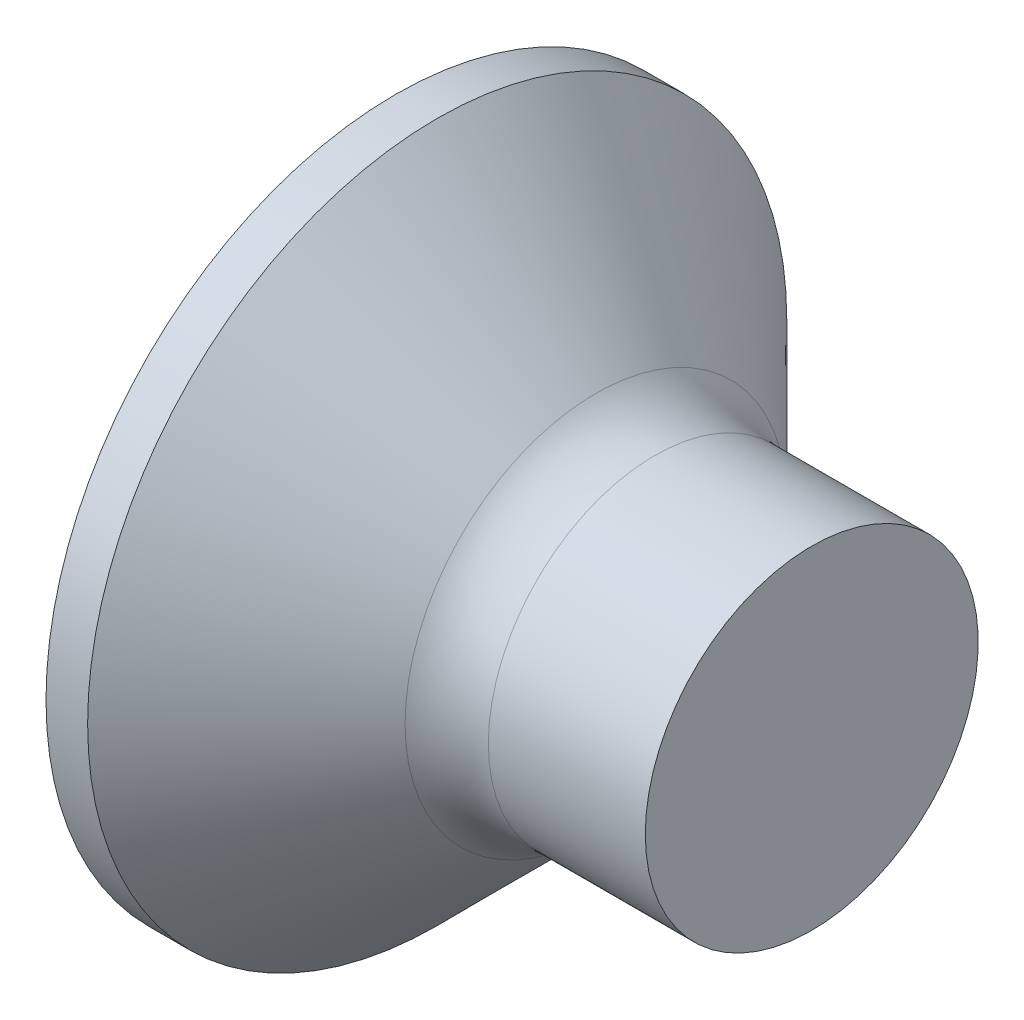
ISO-10303-21;
HEADER;
FILE_DESCRIPTION(('STEP AP214'),'2;1');
FILE_NAME('part.step','',(''),(''),'','','');
FILE_SCHEMA(('AUTOMOTIVE_DESIGN { 1 0 10303 214 1 1 1 1 }'));
ENDSEC;
DATA;
#1=APPLICATION_CONTEXT('core data for automotive mechanical design processes');
#2=APPLICATION_PROTOCOL_DEFINITION('international standard','automotive_design',2000,#1);
#3=PRODUCT_CONTEXT('',#1,'mechanical');
#4=PRODUCT('Part','Part','',(#3));
#5=PRODUCT_RELATED_PRODUCT_CATEGORY('part','',(#4));
#6=PRODUCT_DEFINITION_FORMATION('','',#4);
#7=PRODUCT_DEFINITION_CONTEXT('part definition',#1,'design');
#8=PRODUCT_DEFINITION('design','',#6,#7);
#9=PRODUCT_DEFINITION_SHAPE('','',#8);
#10=(LENGTH_UNIT() NAMED_UNIT(*) SI_UNIT(.MILLI.,.METRE.));
#11=(NAMED_UNIT(*) PLANE_ANGLE_UNIT() SI_UNIT($,.RADIAN.));
#12=(NAMED_UNIT(*) SI_UNIT($,.STERADIAN.) SOLID_ANGLE_UNIT());
#13=UNCERTAINTY_MEASURE_WITH_UNIT(LENGTH_MEASURE(1.E-05),#10,'distance_accuracy_value','');
#14=(GEOMETRIC_REPRESENTATION_CONTEXT(3) GLOBAL_UNCERTAINTY_ASSIGNED_CONTEXT((#13)) GLOBAL_UNIT_ASSIGNED_CONTEXT((#10,
#11,#12)) REPRESENTATION_CONTEXT('',''));
#15=CARTESIAN_POINT('',(0.,0.,0.));
#16=DIRECTION('',(0.,0.,1.));
#17=DIRECTION('',(1.,0.,0.));
#18=AXIS2_PLACEMENT_3D('',#15,#16,#17);
#19=CARTESIAN_POINT('',(9.32000000000025,0.,4.16333634234434E-13));
#20=DIRECTION('',(-1.00000000000003,0.,0.));
#21=DIRECTION('',(0.,-1.00000000000001,0.));
#22=AXIS2_PLACEMENT_3D('',#19,#20,#21);
#23=SPHERICAL_SURFACE('',#22,9.32000000000001);
#24=CARTESIAN_POINT('',(1.,0.,0.));
#25=DIRECTION('',(-1.00000000000003,0.,0.));
#26=DIRECTION('',(0.,0.,1.00000000000002));
#27=AXIS2_PLACEMENT_3D('',#24,#25,#26);
#28=CIRCLE('',#27,4.2);
#29=CARTESIAN_POINT('',(1.00000000000003,0.,4.20000000000008));
#30=VERTEX_POINT('',#29);
#31=EDGE_CURVE('E219',#30,#30,#28,.T.);
#32=ORIENTED_EDGE('',*,*,#31,.T.);
#33=EDGE_LOOP('',(#32));
#34=FACE_BOUND('',#33,.T.);
#35=CARTESIAN_POINT('',(9.32000000000001,0.515000000000029,0.));
#36=DIRECTION('',(0.,-1.00000000000001,0.));
#37=DIRECTION('',(0.,0.,-1.00000000000002));
#38=AXIS2_PLACEMENT_3D('',#35,#36,#37);
#39=CIRCLE('',#38,9.3057603128385);
#40=CARTESIAN_POINT('',(0.314127642384535,0.515000000000015,-2.3433817611174));
#41=VERTEX_POINT('',#40);
#42=CARTESIAN_POINT('',(0.0608783606674719,0.515000000000036,-0.930506027946754));
#43=VERTEX_POINT('',#42);
#44=EDGE_CURVE('E299',#41,#43,#39,.F.);
#45=ORIENTED_EDGE('',*,*,#44,.T.);
#46=CARTESIAN_POINT('',(0.0608783606675656,0.,0.));
#47=DIRECTION('',(1.00000000000003,0.,0.));
#48=DIRECTION('',(0.,0.,-1.00000000000002));
#49=AXIS2_PLACEMENT_3D('',#46,#47,#48);
#50=CIRCLE('',#49,1.06351608734703);
#51=CARTESIAN_POINT('',(0.060878360667576,0.930506027947121,-0.514999999999988));
#52=VERTEX_POINT('',#51);
#53=EDGE_CURVE('E328',#43,#52,#50,.T.);
#54=ORIENTED_EDGE('',*,*,#53,.T.);
#55=CARTESIAN_POINT('',(9.32000000000025,0.,-0.514999999999571));
#56=DIRECTION('',(0.,0.,1.00000000000002));
#57=DIRECTION('',(1.00000000000003,0.,0.));
#58=AXIS2_PLACEMENT_3D('',#55,#56,#57);
#59=CIRCLE('',#58,9.3057603128385);
#60=CARTESIAN_POINT('',(0.314127642384403,2.34338176111742,-0.515000000000071));
#61=VERTEX_POINT('',#60);
#62=EDGE_CURVE('E241',#52,#61,#59,.F.);
#63=ORIENTED_EDGE('',*,*,#62,.T.);
#64=CARTESIAN_POINT('',(8.46275279202835,-1.71937218999611,4.9960036108132E-13));
#65=DIRECTION('',(0.446197753347447,0.894934391398446,0.));
#66=DIRECTION('',(-0.894934391398466,0.44619775334744,0.));
#67=AXIS2_PLACEMENT_3D('',#64,#65,#66);
#68=CIRCLE('',#67,9.11982930194927);
#69=CARTESIAN_POINT('',(0.314127642384528,2.34338176111739,0.514999999999988));
#70=VERTEX_POINT('',#69);
#71=EDGE_CURVE('E245',#70,#61,#68,.F.);
#72=ORIENTED_EDGE('',*,*,#71,.F.);
#73=CARTESIAN_POINT('',(9.32000000000001,0.,0.514999999999988));
#74=DIRECTION('',(0.,0.,-1.00000000000002));
#75=DIRECTION('',(0.,1.00000000000001,0.));
#76=AXIS2_PLACEMENT_3D('',#73,#74,#75);
#77=CIRCLE('',#76,9.3057603128385);
#78=CARTESIAN_POINT('',(0.0608783606675725,0.930506027947121,0.514999999999988));
#79=VERTEX_POINT('',#78);
#80=EDGE_CURVE('E238',#70,#79,#77,.F.);
#81=ORIENTED_EDGE('',*,*,#80,.T.);
#82=CARTESIAN_POINT('',(0.0608783606676662,0.514999999999925,0.930506027946421));
#83=VERTEX_POINT('',#82);
#84=EDGE_CURVE('E354',#79,#83,#50,.T.);
#85=ORIENTED_EDGE('',*,*,#84,.T.);
#86=CARTESIAN_POINT('',(0.314127642384528,0.514999999999995,2.34338176111737));
#87=VERTEX_POINT('',#86);
#88=EDGE_CURVE('E266',#83,#87,#39,.F.);
#89=ORIENTED_EDGE('',*,*,#88,.T.);
#90=CARTESIAN_POINT('',(8.46275279202814,0.,-1.71937218999613));
#91=DIRECTION('',(0.446197753347453,0.,0.894934391398461));
#92=DIRECTION('',(0.894934391398459,0.,-0.446197753347437));
#93=AXIS2_PLACEMENT_3D('',#90,#91,#92);
#94=CIRCLE('',#93,9.11982930194927);
#95=CARTESIAN_POINT('',(0.314127642384577,-0.515000000000009,2.34338176111742));
#96=VERTEX_POINT('',#95);
#97=EDGE_CURVE('E63',#96,#87,#94,.F.);
#98=ORIENTED_EDGE('',*,*,#97,.F.);
#99=CARTESIAN_POINT('',(9.3200000000002,-0.514999999999856,-1.38777878078145E-13));
#100=DIRECTION('',(0.,1.00000000000001,0.));
#101=DIRECTION('',(0.,0.,1.00000000000002));
#102=AXIS2_PLACEMENT_3D('',#99,#100,#101);
#103=CIRCLE('',#102,9.3057603128385);
#104=CARTESIAN_POINT('',(0.060878360667458,-0.514999999999967,0.93050602794803));
#105=VERTEX_POINT('',#104);
#106=EDGE_CURVE('E269',#96,#105,#103,.F.);
#107=ORIENTED_EDGE('',*,*,#106,.T.);
#108=CARTESIAN_POINT('',(0.0608783606675396,-0.930506027947114,0.515000000000015));
#109=VERTEX_POINT('',#108);
#110=EDGE_CURVE('E385',#105,#109,#50,.T.);
#111=ORIENTED_EDGE('',*,*,#110,.T.);
#112=CARTESIAN_POINT('',(0.314127642384464,-2.34338176111735,0.515000000000737));
#113=VERTEX_POINT('',#112);
#114=EDGE_CURVE('E237',#109,#113,#77,.F.);
#115=ORIENTED_EDGE('',*,*,#114,.T.);
#116=CARTESIAN_POINT('',(8.46275279202814,1.71937218999612,0.));
#117=DIRECTION('',(0.446197753347446,-0.894934391398446,0.));
#118=DIRECTION('',(0.894934391398464,0.44619775334744,0.));
#119=AXIS2_PLACEMENT_3D('',#116,#117,#118);
#120=CIRCLE('',#119,9.11982930194927);
#121=CARTESIAN_POINT('',(0.314127642384527,-2.34338176111738,-0.514999999999988));
#122=VERTEX_POINT('',#121);
#123=EDGE_CURVE('E235',#122,#113,#120,.F.);
#124=ORIENTED_EDGE('',*,*,#123,.F.);
#125=CARTESIAN_POINT('',(0.0608783606675465,-0.930506027947121,-0.515000000000015));
#126=VERTEX_POINT('',#125);
#127=EDGE_CURVE('E242',#122,#126,#59,.F.);
#128=ORIENTED_EDGE('',*,*,#127,.T.);
#129=CARTESIAN_POINT('',(0.0608783606675135,-0.514999999999995,-0.930506027946892));
#130=VERTEX_POINT('',#129);
#131=EDGE_CURVE('E349',#126,#130,#50,.T.);
#132=ORIENTED_EDGE('',*,*,#131,.T.);
#133=CARTESIAN_POINT('',(0.314127642384528,-0.514999999999995,-2.34338176111742));
#134=VERTEX_POINT('',#133);
#135=EDGE_CURVE('E271',#130,#134,#103,.F.);
#136=ORIENTED_EDGE('',*,*,#135,.T.);
#137=CARTESIAN_POINT('',(8.46275279202814,0.,1.7193721899961));
#138=DIRECTION('',(0.44619775334744,0.,-0.894934391398458));
#139=DIRECTION('',(-0.894934391398467,0.,-0.44619775334745));
#140=AXIS2_PLACEMENT_3D('',#137,#138,#139);
#141=CIRCLE('',#140,9.11982930194927);
#142=EDGE_CURVE('E248',#41,#134,#141,.F.);
#143=ORIENTED_EDGE('',*,*,#142,.F.);
#144=EDGE_LOOP('',(#45,#54,#63,#72,#81,#85,#89,#98,#107,#111,#115,#124,#128,#132,#136,#143));
#145=FACE_BOUND('',#144,.T.);
#146=ADVANCED_FACE('F50',(#34,#145),#23,.T.);
#147=CARTESIAN_POINT('',(3.1,0.954397273507816,-0.515000000000015));
#148=DIRECTION('',(0.,0.,1.00000000000002));
#149=DIRECTION('',(1.00000000000003,0.,0.));
#150=AXIS2_PLACEMENT_3D('',#147,#148,#149);
#151=PLANE('',#150);
#152=ORIENTED_EDGE('',*,*,#62,.F.);
#153=CARTESIAN_POINT('',(-1.51350935868056,1.05457609529699,-0.515000000000376));
#154=CARTESIAN_POINT('',(-1.19095756898951,1.02946929695742,-0.514999999999763));
#155=CARTESIAN_POINT('',(-0.868418100655389,1.00420218778787,-0.514999999999799));
#156=CARTESIAN_POINT('',(-0.223370410701515,0.953235962920859,-0.515000000000189));
#157=CARTESIAN_POINT('',(0.0991378106119281,0.927536843349424,-0.515000000000544));
#158=CARTESIAN_POINT('',(0.744110602564961,0.875595660283778,-0.515000000000597));
#159=CARTESIAN_POINT('',(1.06657517320613,0.849353596809251,-0.515000000000294));
#160=CARTESIAN_POINT('',(1.71144366881838,0.796155443949094,-0.514999999999716));
#161=CARTESIAN_POINT('',(2.03384759413785,0.769199358799947,-0.51499999999944));
#162=CARTESIAN_POINT('',(2.59585161484893,0.721356774291815,-0.514999999999621));
#163=CARTESIAN_POINT('',(2.83547018368547,0.700687775889212,-0.514999999999908));
#164=CARTESIAN_POINT('',(3.31464494543874,0.65864673480125,-0.515000000000121));
#165=CARTESIAN_POINT('',(3.55420113855084,0.637274694345312,-0.515000000000048));
#166=CARTESIAN_POINT('',(4.03323585074641,0.593604611178476,-0.51499999999999));
#167=CARTESIAN_POINT('',(4.27271436777159,0.571306545674769,-0.515000000000005));
#168=CARTESIAN_POINT('',(4.75154290591159,0.525345817751324,-0.515000000000041));
#169=CARTESIAN_POINT('',(4.99089292544569,0.501683138916141,-0.515000000000061));
#170=CARTESIAN_POINT('',(5.23015335451578,0.477118870369921,-0.515000000000043));
#171=B_SPLINE_CURVE_WITH_KNOTS('',3,(#153,#154,#155,#156,#157,#158,#159,#160,#161,#162,#163,
#164,#165,#166,#167,#168,#169,#170),.UNSPECIFIED.,.F.,.F.,(4,2,2,2,2,2,2,2,4),(0.,
0.970582535235078,1.941173778623,2.9117649868231,3.88235043753313,4.6038746538778,
5.32539658241392,6.04693628073918,6.76848466054717),.UNSPECIFIED.);
#172=CARTESIAN_POINT('',(3.10000000000001,0.677477674908923,-0.514999999999655));
#173=VERTEX_POINT('',#172);
#174=EDGE_CURVE('E374',#52,#173,#171,.T.);
#175=ORIENTED_EDGE('',*,*,#174,.T.);
#176=DIRECTION('',(0.,1.00000000000001,0.));
#177=VECTOR('',#176,1.);
#178=CARTESIAN_POINT('',(3.1,-0.954397273507775,-0.514999999999738));
#179=LINE('',#178,#177);
#180=CARTESIAN_POINT('',(3.1,0.954397273507816,-0.515000000000015));
#181=VERTEX_POINT('',#180);
#182=EDGE_CURVE('E319',#173,#181,#179,.T.);
#183=ORIENTED_EDGE('',*,*,#182,.T.);
#184=DIRECTION('',(0.894934391398466,-0.44619775334744,0.));
#185=VECTOR('',#184,1.);
#186=CARTESIAN_POINT('',(0.,2.50000000000004,-0.514999999999044));
#187=LINE('',#186,#185);
#188=EDGE_CURVE('E216',#61,#181,#187,.T.);
#189=ORIENTED_EDGE('',*,*,#188,.F.);
#190=EDGE_LOOP('',(#152,#175,#183,#189));
#191=FACE_BOUND('',#190,.T.);
#192=ADVANCED_FACE('F184',(#191),#151,.T.);
#193=CARTESIAN_POINT('',(3.1,-0.954397273507775,-0.514999999999738));
#194=VERTEX_POINT('',#193);
#195=CARTESIAN_POINT('',(3.0999999999999,-0.677477674908923,-0.515000000000043));
#196=VERTEX_POINT('',#195);
#197=EDGE_CURVE('E225',#194,#196,#179,.T.);
#198=ORIENTED_EDGE('',*,*,#197,.T.);
#199=CARTESIAN_POINT('',(-1.51350935868085,-1.05457609529696,-0.514999999999238));
#200=CARTESIAN_POINT('',(-1.19095756898975,-1.02946929695741,-0.514999999999702));
#201=CARTESIAN_POINT('',(-0.868418100655579,-1.00420218778787,-0.514999999999906));
#202=CARTESIAN_POINT('',(-0.223370410701601,-0.953235962920857,-0.515000000000072));
#203=CARTESIAN_POINT('',(0.0991378106118933,-0.927536843349416,-0.515000000000034));
#204=CARTESIAN_POINT('',(0.744110602564978,-0.875595660283777,-0.514999999999996));
#205=CARTESIAN_POINT('',(1.06657517320615,-0.849353596809264,-0.514999999999996));
#206=CARTESIAN_POINT('',(1.71144366881839,-0.796155443949056,-0.515000000000005));
#207=CARTESIAN_POINT('',(2.03384759413786,-0.769199358799845,-0.515000000000015));
#208=CARTESIAN_POINT('',(2.59585161484894,-0.721356774291734,-0.515000000000016));
#209=CARTESIAN_POINT('',(2.83547018368548,-0.700687775889181,-0.515000000000012));
#210=CARTESIAN_POINT('',(3.31464494543875,-0.658646734801257,-0.51500000000001));
#211=CARTESIAN_POINT('',(3.55420113855085,-0.637274694345305,-0.515000000000013));
#212=CARTESIAN_POINT('',(4.03323585074641,-0.593604611178459,-0.515000000000018));
#213=CARTESIAN_POINT('',(4.27271436777159,-0.571306545674755,-0.515000000000019));
#214=CARTESIAN_POINT('',(4.75154290591158,-0.525345817751316,-0.51500000000002));
#215=CARTESIAN_POINT('',(4.99089292544568,-0.501683138916135,-0.515000000000019));
#216=CARTESIAN_POINT('',(5.23015335451578,-0.477118870369907,-0.515000000000015));
#217=B_SPLINE_CURVE_WITH_KNOTS('',3,(#199,#200,#201,#202,#203,#204,#205,#206,#207,#208,#209,
#210,#211,#212,#213,#214,#215,#216),.UNSPECIFIED.,.F.,.F.,(4,2,2,2,2,2,2,2,4),(0.,
0.970582535235234,1.94117377862331,2.91176498682341,3.88235043753344,4.6038746538781,
5.32539658241422,6.04693628073947,6.76848466054746),.UNSPECIFIED.);
#218=EDGE_CURVE('E353',#196,#126,#217,.F.);
#219=ORIENTED_EDGE('',*,*,#218,.T.);
#220=ORIENTED_EDGE('',*,*,#127,.F.);
#221=DIRECTION('',(0.894934391398464,0.44619775334744,0.));
#222=VECTOR('',#221,1.);
#223=CARTESIAN_POINT('',(-1.82145964977565E-13,-2.50000000000001,-0.515000000000737));
#224=LINE('',#223,#222);
#225=EDGE_CURVE('E78',#122,#194,#224,.T.);
#226=ORIENTED_EDGE('',*,*,#225,.T.);
#227=EDGE_LOOP('',(#198,#219,#220,#226));
#228=FACE_BOUND('',#227,.T.);
#229=ADVANCED_FACE('F190',(#228),#151,.T.);
#230=CARTESIAN_POINT('',(3.10000000000001,-0.954397273507802,0.514999999999349));
#231=DIRECTION('',(0.,0.,-1.00000000000002));
#232=DIRECTION('',(0.,1.00000000000001,0.));
#233=AXIS2_PLACEMENT_3D('',#230,#231,#232);
#234=PLANE('',#233);
#235=DIRECTION('',(0.,-1.00000000000001,0.));
#236=VECTOR('',#235,1.);
#237=CARTESIAN_POINT('',(3.1,0.954397273507809,0.51499999999996));
#238=LINE('',#237,#236);
#239=CARTESIAN_POINT('',(3.1,0.954397273507809,0.51499999999996));
#240=VERTEX_POINT('',#239);
#241=CARTESIAN_POINT('',(3.1,0.677477674908965,0.515000000000071));
#242=VERTEX_POINT('',#241);
#243=EDGE_CURVE('E309',#240,#242,#238,.T.);
#244=ORIENTED_EDGE('',*,*,#243,.T.);
#245=CARTESIAN_POINT('',(-1.51350936111663,1.0545760954866,0.514999999999988));
#246=CARTESIAN_POINT('',(-1.19095757112499,1.02946929712489,0.514999999999085));
#247=CARTESIAN_POINT('',(-0.868418102490322,1.00420218793258,0.514999999999124));
#248=CARTESIAN_POINT('',(-0.223370411935403,0.953235963019201,0.514999999999608));
#249=CARTESIAN_POINT('',(0.0991378096785376,0.927536843424175,0.515000000000052));
#250=CARTESIAN_POINT('',(0.744110602455241,0.875595660293039,0.514999999999867));
#251=CARTESIAN_POINT('',(1.06657517361956,0.849353596776238,0.514999999999238));
#252=CARTESIAN_POINT('',(1.71144367027781,0.796155443828322,0.514999999999472));
#253=CARTESIAN_POINT('',(2.03384759612015,0.76919935863369,0.515000000000335));
#254=CARTESIAN_POINT('',(2.59585161735382,0.721356774076706,0.515000000000165));
#255=CARTESIAN_POINT('',(2.83547018619021,0.700687775672286,0.514999999999561));
#256=CARTESIAN_POINT('',(3.31464494794309,0.658646734579638,0.514999999999131));
#257=CARTESIAN_POINT('',(3.55420114105495,0.637274694120829,0.514999999999305));
#258=CARTESIAN_POINT('',(4.03323585324995,0.593604610947415,0.514999999999379));
#259=CARTESIAN_POINT('',(4.27271437027482,0.571306545440001,0.514999999999278));
#260=CARTESIAN_POINT('',(4.75154290841397,0.5253458175071,0.514999999999397));
#261=CARTESIAN_POINT('',(4.99089292794753,0.501683138666166,0.514999999999617));
#262=CARTESIAN_POINT('',(5.23015335701691,0.477118870112571,0.515000000000293));
#263=B_SPLINE_CURVE_WITH_KNOTS('',3,(#245,#246,#247,#248,#249,#250,#251,#252,#253,#254,#255,
#256,#257,#258,#259,#260,#261,#262),.UNSPECIFIED.,.F.,.F.,(4,2,2,2,2,2,2,2,4),(0.,
0.970582536139299,1.94117378043148,2.91176499020613,3.88235044249066,4.60387465883537,
5.32539658737152,6.04693628569685,6.76848466550495),.UNSPECIFIED.);
#264=EDGE_CURVE('E276',#242,#79,#263,.F.);
#265=ORIENTED_EDGE('',*,*,#264,.T.);
#266=ORIENTED_EDGE('',*,*,#80,.F.);
#267=DIRECTION('',(0.894934391398466,-0.44619775334744,0.));
#268=VECTOR('',#267,1.);
#269=CARTESIAN_POINT('',(0.,2.5,0.515000000000043));
#270=LINE('',#269,#268);
#271=EDGE_CURVE('E222',#70,#240,#270,.T.);
#272=ORIENTED_EDGE('',*,*,#271,.T.);
#273=EDGE_LOOP('',(#244,#265,#266,#272));
#274=FACE_BOUND('',#273,.T.);
#275=ADVANCED_FACE('F370',(#274),#234,.T.);
#276=ORIENTED_EDGE('',*,*,#114,.F.);
#277=CARTESIAN_POINT('',(-1.51350936111664,-1.0545760954866,0.51499999999996));
#278=CARTESIAN_POINT('',(-1.19095757112499,-1.02946929712488,0.51499999999913));
#279=CARTESIAN_POINT('',(-0.868418102490328,-1.00420218793256,0.51499999999915));
#280=CARTESIAN_POINT('',(-0.223370411935408,-0.953235963019182,0.514999999999591));
#281=CARTESIAN_POINT('',(0.0991378096785321,-0.927536843424156,0.515000000000013));
#282=CARTESIAN_POINT('',(0.744110602455256,-0.875595660293029,0.514999999999962));
#283=CARTESIAN_POINT('',(1.06657517361959,-0.849353596776237,0.514999999999489));
#284=CARTESIAN_POINT('',(1.71144367027788,-0.796155443828281,0.514999999999229));
#285=CARTESIAN_POINT('',(2.03384759612023,-0.7691993586336,0.514999999999443));
#286=CARTESIAN_POINT('',(2.59585161735391,-0.72135677407663,0.514999999999473));
#287=CARTESIAN_POINT('',(2.8354701861903,-0.700687775672249,0.514999999999378));
#288=CARTESIAN_POINT('',(3.31464494794316,-0.658646734579629,0.514999999999319));
#289=CARTESIAN_POINT('',(3.55420114105501,-0.637274694120809,0.514999999999355));
#290=CARTESIAN_POINT('',(4.03323585324999,-0.593604610947393,0.514999999999333));
#291=CARTESIAN_POINT('',(4.27271437027485,-0.571306545439987,0.514999999999276));
#292=CARTESIAN_POINT('',(4.75154290841397,-0.525345817507078,0.514999999999405));
#293=CARTESIAN_POINT('',(4.99089292794753,-0.50168313866613,0.514999999999592));
#294=CARTESIAN_POINT('',(5.2301533570169,-0.477118870112488,0.515000000000071));
#295=B_SPLINE_CURVE_WITH_KNOTS('',3,(#277,#278,#279,#280,#281,#282,#283,#284,#285,#286,#287,
#288,#289,#290,#291,#292,#293,#294),.UNSPECIFIED.,.F.,.F.,(4,2,2,2,2,2,2,2,4),(0.,
0.970582536139301,1.94117378043149,2.91176499020618,3.88235044249078,4.60387465883546,
5.32539658737158,6.04693628569688,6.76848466550495),.UNSPECIFIED.);
#296=CARTESIAN_POINT('',(3.10000000000004,-0.677477674908909,0.514999999999766));
#297=VERTEX_POINT('',#296);
#298=EDGE_CURVE('E386',#109,#297,#295,.T.);
#299=ORIENTED_EDGE('',*,*,#298,.T.);
#300=CARTESIAN_POINT('',(3.10000000000001,-0.954397273507802,0.514999999999349));
#301=VERTEX_POINT('',#300);
#302=EDGE_CURVE('E311',#297,#301,#238,.T.);
#303=ORIENTED_EDGE('',*,*,#302,.T.);
#304=DIRECTION('',(0.894934391398464,0.44619775334744,0.));
#305=VECTOR('',#304,1.);
#306=CARTESIAN_POINT('',(0.,-2.5,0.514999999999988));
#307=LINE('',#306,#305);
#308=EDGE_CURVE('E303',#113,#301,#307,.T.);
#309=ORIENTED_EDGE('',*,*,#308,.F.);
#310=EDGE_LOOP('',(#276,#299,#303,#309));
#311=FACE_BOUND('',#310,.T.);
#312=ADVANCED_FACE('F495',(#311),#234,.T.);
#313=CARTESIAN_POINT('',(3.1,0.954397273507816,-0.515000000000015));
#314=DIRECTION('',(-1.00000000000003,0.,0.));
#315=DIRECTION('',(0.,0.,1.00000000000002));
#316=AXIS2_PLACEMENT_3D('',#313,#314,#315);
#317=PLANE('',#316);
#318=ORIENTED_EDGE('',*,*,#302,.F.);
#319=CARTESIAN_POINT('',(3.1,0.,0.));
#320=DIRECTION('',(-1.00000000000003,0.,0.));
#321=DIRECTION('',(0.,0.,1.00000000000002));
#322=AXIS2_PLACEMENT_3D('',#319,#320,#321);
#323=CIRCLE('',#322,0.850999999999999);
#324=EDGE_CURVE('E346',#196,#297,#323,.T.);
#325=ORIENTED_EDGE('',*,*,#324,.F.);
#326=ORIENTED_EDGE('',*,*,#197,.F.);
#327=DIRECTION('',(0.,0.,1.00000000000002));
#328=VECTOR('',#327,1.);
#329=CARTESIAN_POINT('',(3.1,-0.954397273507775,-0.514999999999738));
#330=LINE('',#329,#328);
#331=EDGE_CURVE('E306',#194,#301,#330,.T.);
#332=ORIENTED_EDGE('',*,*,#331,.T.);
#333=EDGE_LOOP('',(#318,#325,#326,#332));
#334=FACE_BOUND('',#333,.T.);
#335=ADVANCED_FACE('F415',(#334),#317,.T.);
#336=DIRECTION('',(0.,0.,-1.00000000000002));
#337=VECTOR('',#336,1.);
#338=CARTESIAN_POINT('',(3.10000000000015,-0.514999999999773,0.954397273508545));
#339=LINE('',#338,#337);
#340=CARTESIAN_POINT('',(3.1,-0.514999999999981,-0.677477674908944));
#341=VERTEX_POINT('',#340);
#342=CARTESIAN_POINT('',(3.1,-0.514999999999988,-0.954397273507851));
#343=VERTEX_POINT('',#342);
#344=EDGE_CURVE('E293',#341,#343,#339,.T.);
#345=ORIENTED_EDGE('',*,*,#344,.F.);
#346=CARTESIAN_POINT('',(3.1,0.515000000000175,-0.677477674909194));
#347=VERTEX_POINT('',#346);
#348=EDGE_CURVE('E70',#347,#341,#323,.T.);
#349=ORIENTED_EDGE('',*,*,#348,.F.);
#350=DIRECTION('',(0.,0.,1.00000000000002));
#351=VECTOR('',#350,1.);
#352=CARTESIAN_POINT('',(3.09999999999993,0.514999999999981,-0.954397273508378));
#353=LINE('',#352,#351);
#354=CARTESIAN_POINT('',(3.09999999999993,0.514999999999981,-0.954397273508378));
#355=VERTEX_POINT('',#354);
#356=EDGE_CURVE('E296',#355,#347,#353,.T.);
#357=ORIENTED_EDGE('',*,*,#356,.F.);
#358=DIRECTION('',(0.,-1.00000000000001,0.));
#359=VECTOR('',#358,1.);
#360=CARTESIAN_POINT('',(3.09999999999993,0.514999999999981,-0.954397273508378));
#361=LINE('',#360,#359);
#362=EDGE_CURVE('E287',#355,#343,#361,.T.);
#363=ORIENTED_EDGE('',*,*,#362,.T.);
#364=EDGE_LOOP('',(#345,#349,#357,#363));
#365=FACE_BOUND('',#364,.T.);
#366=ADVANCED_FACE('F341',(#365),#317,.T.);
#367=ORIENTED_EDGE('',*,*,#182,.F.);
#368=EDGE_CURVE('E345',#242,#173,#323,.T.);
#369=ORIENTED_EDGE('',*,*,#368,.F.);
#370=ORIENTED_EDGE('',*,*,#243,.F.);
#371=DIRECTION('',(0.,0.,-1.00000000000002));
#372=VECTOR('',#371,1.);
#373=CARTESIAN_POINT('',(3.1,0.954397273507809,0.51499999999996));
#374=LINE('',#373,#372);
#375=EDGE_CURVE('E312',#240,#181,#374,.T.);
#376=ORIENTED_EDGE('',*,*,#375,.T.);
#377=EDGE_LOOP('',(#367,#369,#370,#376));
#378=FACE_BOUND('',#377,.T.);
#379=ADVANCED_FACE('F416',(#378),#317,.T.);
#380=CARTESIAN_POINT('',(3.09999999999995,0.515000000000175,0.954397273508711));
#381=DIRECTION('',(0.,-1.00000000000001,0.));
#382=DIRECTION('',(1.00000000000003,0.,0.));
#383=AXIS2_PLACEMENT_3D('',#380,#381,#382);
#384=PLANE('',#383);
#385=ORIENTED_EDGE('',*,*,#88,.F.);
#386=CARTESIAN_POINT('',(-1.51350936111665,0.515000000000009,1.05457609548662));
#387=CARTESIAN_POINT('',(-1.19095757112505,0.515000000000249,1.02946929712425));
#388=CARTESIAN_POINT('',(-0.868418102490382,0.51500000000024,1.00420218793195));
#389=CARTESIAN_POINT('',(-0.223370411935427,0.51500000000011,0.953235963018925));
#390=CARTESIAN_POINT('',(0.0991378096785429,0.51499999999999,0.927536843424221));
#391=CARTESIAN_POINT('',(0.744110602455241,0.515000000000027,0.875595660292952));
#392=CARTESIAN_POINT('',(1.06657517361952,0.515000000000184,0.849353596775694));
#393=CARTESIAN_POINT('',(1.71144367027778,0.515000000000167,0.79615544382781));
#394=CARTESIAN_POINT('',(2.03384759612016,0.514999999999993,0.769199358633667));
#395=CARTESIAN_POINT('',(2.59585161735383,0.51500000000002,0.721356774076565));
#396=CARTESIAN_POINT('',(2.8354701861902,0.515000000000136,0.700687775671788));
#397=CARTESIAN_POINT('',(3.31464494794308,0.515000000000218,0.658646734578863));
#398=CARTESIAN_POINT('',(3.55420114105495,0.515000000000184,0.637274694120135));
#399=CARTESIAN_POINT('',(4.03323585324997,0.51500000000017,0.593604610946699));
#400=CARTESIAN_POINT('',(4.27271437027483,0.515000000000189,0.571306545439181));
#401=CARTESIAN_POINT('',(4.751542908414,0.515000000000166,0.525345817506334));
#402=CARTESIAN_POINT('',(4.99089292794759,0.515000000000124,0.50168313866556));
#403=CARTESIAN_POINT('',(5.23015335701703,0.514999999999995,0.477118870112481));
#404=B_SPLINE_CURVE_WITH_KNOTS('',3,(#386,#387,#388,#389,#390,#391,#392,#393,#394,#395,#396,
#397,#398,#399,#400,#401,#402,#403),.UNSPECIFIED.,.F.,.F.,(4,2,2,2,2,2,2,2,4),(0.,
0.970582536139311,1.94117378043151,2.91176499020615,3.8823504424907,4.60387465883543,
5.32539658737161,6.04693628569697,6.76848466550509),.UNSPECIFIED.);
#405=CARTESIAN_POINT('',(3.1,0.515000000000009,0.677477674908916));
#406=VERTEX_POINT('',#405);
#407=EDGE_CURVE('E548',#83,#406,#404,.T.);
#408=ORIENTED_EDGE('',*,*,#407,.T.);
#409=CARTESIAN_POINT('',(3.09999999999995,0.515000000000175,0.954397273508711));
#410=VERTEX_POINT('',#409);
#411=EDGE_CURVE('E268',#406,#410,#353,.T.);
#412=ORIENTED_EDGE('',*,*,#411,.T.);
#413=DIRECTION('',(0.894934391398459,0.,-0.446197753347437));
#414=VECTOR('',#413,1.);
#415=CARTESIAN_POINT('',(1.07552855510562E-13,0.515000000000009,2.49999999999995));
#416=LINE('',#415,#414);
#417=EDGE_CURVE('E258',#87,#410,#416,.T.);
#418=ORIENTED_EDGE('',*,*,#417,.F.);
#419=EDGE_LOOP('',(#385,#408,#412,#418));
#420=FACE_BOUND('',#419,.T.);
#421=ADVANCED_FACE('F264',(#420),#384,.T.);
#422=CARTESIAN_POINT('',(3.1,-0.514999999999988,-0.954397273507851));
#423=DIRECTION('',(0.,1.00000000000001,0.));
#424=DIRECTION('',(0.,0.,1.00000000000002));
#425=AXIS2_PLACEMENT_3D('',#422,#423,#424);
#426=PLANE('',#425);
#427=CARTESIAN_POINT('',(3.10000000000015,-0.514999999999773,0.954397273508545));
#428=VERTEX_POINT('',#427);
#429=CARTESIAN_POINT('',(3.10000000000004,-0.514999999999856,0.677477674909749));
#430=VERTEX_POINT('',#429);
#431=EDGE_CURVE('E290',#428,#430,#339,.T.);
#432=ORIENTED_EDGE('',*,*,#431,.T.);
#433=CARTESIAN_POINT('',(-1.51350936111676,-0.514999999999925,1.05457609548756));
#434=CARTESIAN_POINT('',(-1.19095757112518,-0.514999999999973,1.02946929712461));
#435=CARTESIAN_POINT('',(-0.868418102490493,-0.514999999999993,1.00420218793212));
#436=CARTESIAN_POINT('',(-0.223370411935491,-0.515000000000007,0.953235963018945));
#437=CARTESIAN_POINT('',(0.0991378096785143,-0.515000000000002,0.927536843424301));
#438=CARTESIAN_POINT('',(0.744110602455226,-0.515000000000001,0.87559566029293));
#439=CARTESIAN_POINT('',(1.06657517361948,-0.515000000000004,0.849353596775511));
#440=CARTESIAN_POINT('',(1.71144367027778,-0.514999999999993,0.796155443828201));
#441=CARTESIAN_POINT('',(2.03384759612021,-0.514999999999978,0.769199358634792));
#442=CARTESIAN_POINT('',(2.59585161735385,-0.514999999999983,0.721356774077471));
#443=CARTESIAN_POINT('',(2.83547018619016,-0.514999999999994,0.700687775672126));
#444=CARTESIAN_POINT('',(3.31464494794298,-0.515000000000002,0.658646734578786));
#445=CARTESIAN_POINT('',(3.55420114105486,-0.514999999999999,0.637274694120212));
#446=CARTESIAN_POINT('',(4.03323585324988,-0.514999999999996,0.593604610946915));
#447=CARTESIAN_POINT('',(4.27271437027474,-0.514999999999998,0.571306545439383));
#448=CARTESIAN_POINT('',(4.75154290841389,-0.514999999999997,0.525345817506464));
#449=CARTESIAN_POINT('',(4.99089292794747,-0.514999999999995,0.501683138665633));
#450=CARTESIAN_POINT('',(5.2301533570169,-0.514999999999988,0.477118870112536));
#451=B_SPLINE_CURVE_WITH_KNOTS('',3,(#433,#434,#435,#436,#437,#438,#439,#440,#441,#442,#443,
#444,#445,#446,#447,#448,#449,#450),.UNSPECIFIED.,.F.,.F.,(4,2,2,2,2,2,2,2,4),(0.,
0.970582536139398,1.94117378043168,2.91176499020631,3.88235044249083,4.60387465883553,
5.32539658737169,6.04693628569704,6.76848466550514),.UNSPECIFIED.);
#452=EDGE_CURVE('E379',#430,#105,#451,.F.);
#453=ORIENTED_EDGE('',*,*,#452,.T.);
#454=ORIENTED_EDGE('',*,*,#106,.F.);
#455=DIRECTION('',(0.894934391398459,0.,-0.446197753347437));
#456=VECTOR('',#455,1.);
#457=CARTESIAN_POINT('',(0.,-0.515000000000002,2.5));
#458=LINE('',#457,#456);
#459=EDGE_CURVE('E260',#96,#428,#458,.T.);
#460=ORIENTED_EDGE('',*,*,#459,.T.);
#461=EDGE_LOOP('',(#432,#453,#454,#460));
#462=FACE_BOUND('',#461,.T.);
#463=ADVANCED_FACE('F210',(#462),#426,.T.);
#464=ORIENTED_EDGE('',*,*,#356,.T.);
#465=CARTESIAN_POINT('',(-1.51350936111677,0.515000000000189,-1.05457609548695));
#466=CARTESIAN_POINT('',(-1.19095757112516,0.515000000000331,-1.02946929712447));
#467=CARTESIAN_POINT('',(-0.868418102490467,0.515000000000273,-1.0042021879321));
#468=CARTESIAN_POINT('',(-0.223370411935473,0.5150000000001,-0.953235963018972));
#469=CARTESIAN_POINT('',(0.0991378096785191,0.514999999999983,-0.927536843424246));
#470=CARTESIAN_POINT('',(0.74411060245524,0.515000000000034,-0.875595660292984));
#471=CARTESIAN_POINT('',(1.06657517361952,0.5150000000002,-0.849353596775757));
#472=CARTESIAN_POINT('',(1.71144367027778,0.515000000000171,-0.796155443827887));
#473=CARTESIAN_POINT('',(2.03384759612016,0.514999999999977,-0.769199358633729));
#474=CARTESIAN_POINT('',(2.59585161735382,0.515000000000008,-0.721356774076617));
#475=CARTESIAN_POINT('',(2.83547018619017,0.515000000000138,-0.700687775671841));
#476=CARTESIAN_POINT('',(3.31464494794303,0.515000000000231,-0.658646734578917));
#477=CARTESIAN_POINT('',(3.55420114105489,0.515000000000194,-0.637274694120188));
#478=CARTESIAN_POINT('',(4.03323585324988,0.515000000000175,-0.593604610946744));
#479=CARTESIAN_POINT('',(4.27271437027473,0.515000000000194,-0.57130654543922));
#480=CARTESIAN_POINT('',(4.75154290841388,0.515000000000174,-0.525345817506384));
#481=CARTESIAN_POINT('',(4.99089292794746,0.515000000000134,-0.501683138665628));
#482=CARTESIAN_POINT('',(5.23015335701689,0.515000000000009,-0.477118870112592));
#483=B_SPLINE_CURVE_WITH_KNOTS('',3,(#465,#466,#467,#468,#469,#470,#471,#472,#473,#474,#475,
#476,#477,#478,#479,#480,#481,#482),.UNSPECIFIED.,.F.,.F.,(4,2,2,2,2,2,2,2,4),(0.,
0.970582536139382,1.94117378043165,2.91176499020629,3.88235044249083,4.60387465883553,
5.32539658737167,6.046936285697,6.76848466550508),.UNSPECIFIED.);
#484=EDGE_CURVE('E334',#347,#43,#483,.F.);
#485=ORIENTED_EDGE('',*,*,#484,.T.);
#486=ORIENTED_EDGE('',*,*,#44,.F.);
#487=DIRECTION('',(0.894934391398468,0.,0.44619775334745));
#488=VECTOR('',#487,1.);
#489=CARTESIAN_POINT('',(0.,0.515000000000022,-2.50000000000006));
#490=LINE('',#489,#488);
#491=EDGE_CURVE('E273',#41,#355,#490,.T.);
#492=ORIENTED_EDGE('',*,*,#491,.T.);
#493=EDGE_LOOP('',(#464,#485,#486,#492));
#494=FACE_BOUND('',#493,.T.);
#495=ADVANCED_FACE('F208',(#494),#384,.T.);
#496=ORIENTED_EDGE('',*,*,#135,.F.);
#497=CARTESIAN_POINT('',(-1.51350936111664,-0.514999999999884,-1.05457609548662));
#498=CARTESIAN_POINT('',(-1.19095757112503,-0.51499999999994,-1.0294692971245));
#499=CARTESIAN_POINT('',(-0.868418102490358,-0.514999999999971,-1.0042021879322));
#500=CARTESIAN_POINT('',(-0.223370411935418,-0.515000000000004,-0.953235963019053));
#501=CARTESIAN_POINT('',(0.0991378096785404,-0.515000000000005,-0.927536843424231));
#502=CARTESIAN_POINT('',(0.744110602455239,-0.514999999999998,-0.875595660292997));
#503=CARTESIAN_POINT('',(1.06657517361953,-0.514999999999989,-0.849353596775894));
#504=CARTESIAN_POINT('',(1.71144367027779,-0.514999999999988,-0.796155443827978));
#505=CARTESIAN_POINT('',(2.03384759612015,-0.514999999999995,-0.769199358633649));
#506=CARTESIAN_POINT('',(2.59585161735381,-0.514999999999995,-0.72135677407658));
#507=CARTESIAN_POINT('',(2.83547018619018,-0.514999999999991,-0.70068777567193));
#508=CARTESIAN_POINT('',(3.31464494794304,-0.514999999999988,-0.6586467345791));
#509=CARTESIAN_POINT('',(3.55420114105491,-0.514999999999989,-0.63727469412034));
#510=CARTESIAN_POINT('',(4.0332358532499,-0.51499999999999,-0.593604610946891));
#511=CARTESIAN_POINT('',(4.27271437027475,-0.51499999999999,-0.571306545439394));
#512=CARTESIAN_POINT('',(4.7515429084139,-0.514999999999991,-0.525345817506543));
#513=CARTESIAN_POINT('',(4.99089292794748,-0.514999999999992,-0.501683138665743));
#514=CARTESIAN_POINT('',(5.2301533570169,-0.514999999999995,-0.477118870112564));
#515=B_SPLINE_CURVE_WITH_KNOTS('',3,(#497,#498,#499,#500,#501,#502,#503,#504,#505,#506,#507,
#508,#509,#510,#511,#512,#513,#514),.UNSPECIFIED.,.F.,.F.,(4,2,2,2,2,2,2,2,4),(0.,
0.970582536139303,1.94117378043149,2.91176499020614,3.88235044249068,4.60387465883538,
5.32539658737152,6.04693628569685,6.76848466550494),.UNSPECIFIED.);
#516=EDGE_CURVE('E13',#130,#341,#515,.T.);
#517=ORIENTED_EDGE('',*,*,#516,.T.);
#518=ORIENTED_EDGE('',*,*,#344,.T.);
#519=DIRECTION('',(0.894934391398468,0.,0.44619775334745));
#520=VECTOR('',#519,1.);
#521=CARTESIAN_POINT('',(0.,-0.514999999999995,-2.5));
#522=LINE('',#521,#520);
#523=EDGE_CURVE('E284',#134,#343,#522,.T.);
#524=ORIENTED_EDGE('',*,*,#523,.F.);
#525=EDGE_LOOP('',(#496,#517,#518,#524));
#526=FACE_BOUND('',#525,.T.);
#527=ADVANCED_FACE('F200',(#526),#426,.T.);
#528=CARTESIAN_POINT('',(6.00000000000003,0.,0.));
#529=DIRECTION('',(-1.00000000000003,0.,0.));
#530=DIRECTION('',(0.,0.,1.00000000000002));
#531=AXIS2_PLACEMENT_3D('',#528,#529,#530);
#532=PLANE('',#531);
#533=CARTESIAN_POINT('',(6.00000000000003,0.,0.));
#534=DIRECTION('',(-1.00000000000003,0.,0.));
#535=DIRECTION('',(0.,0.,1.00000000000002));
#536=AXIS2_PLACEMENT_3D('',#533,#534,#535);
#537=CIRCLE('',#536,2.);
#538=CARTESIAN_POINT('',(6.00000000000004,0.,2.00000000000001));
#539=VERTEX_POINT('',#538);
#540=EDGE_CURVE('E213',#539,#539,#537,.T.);
#541=ORIENTED_EDGE('',*,*,#540,.F.);
#542=EDGE_LOOP('',(#541));
#543=FACE_BOUND('',#542,.T.);
#544=ADVANCED_FACE('F198',(#543),#532,.F.);
#545=CARTESIAN_POINT('',(-15.8750000000007,0.,-1.66533453693773E-13));
#546=DIRECTION('',(-1.00000000000003,0.,0.));
#547=DIRECTION('',(0.,0.,1.00000000000002));
#548=AXIS2_PLACEMENT_3D('',#545,#546,#547);
#549=CYLINDRICAL_SURFACE('',#548,4.2);
#550=ORIENTED_EDGE('',*,*,#31,.F.);
#551=EDGE_LOOP('',(#550));
#552=FACE_BOUND('',#551,.T.);
#553=CARTESIAN_POINT('',(1.5000000000001,0.,0.));
#554=DIRECTION('',(-1.00000000000003,0.,0.));
#555=DIRECTION('',(0.,0.,1.00000000000002));
#556=AXIS2_PLACEMENT_3D('',#553,#554,#555);
#557=CIRCLE('',#556,4.2);
#558=CARTESIAN_POINT('',(1.50000000000012,0.,4.2));
#559=VERTEX_POINT('',#558);
#560=EDGE_CURVE('E215',#559,#559,#557,.T.);
#561=ORIENTED_EDGE('',*,*,#560,.T.);
#562=EDGE_LOOP('',(#561));
#563=FACE_BOUND('',#562,.T.);
#564=ADVANCED_FACE('F196',(#552,#563),#549,.T.);
#565=CARTESIAN_POINT('',(1.5000000000001,0.,0.));
#566=DIRECTION('',(-1.00000000000003,0.,0.));
#567=DIRECTION('',(0.,0.,1.00000000000002));
#568=AXIS2_PLACEMENT_3D('',#565,#566,#567);
#569=CONICAL_SURFACE('',#568,4.2,0.78539816339745);
#570=CARTESIAN_POINT('',(3.40710678118655,0.,0.));
#571=DIRECTION('',(1.00000000000003,0.,0.));
#572=DIRECTION('',(0.,0.,-1.00000000000002));
#573=AXIS2_PLACEMENT_3D('',#570,#571,#572);
#574=CIRCLE('',#573,2.29289321881345);
#575=CARTESIAN_POINT('',(3.40710678118654,0.,-2.2928932188135));
#576=VERTEX_POINT('',#575);
#577=EDGE_CURVE('E229',#576,#576,#574,.F.);
#578=ORIENTED_EDGE('',*,*,#577,.T.);
#579=EDGE_LOOP('',(#578));
#580=FACE_BOUND('',#579,.T.);
#581=ORIENTED_EDGE('',*,*,#560,.F.);
#582=EDGE_LOOP('',(#581));
#583=FACE_BOUND('',#582,.T.);
#584=ADVANCED_FACE('F206',(#580,#583),#569,.T.);
#585=CARTESIAN_POINT('',(-15.8750000000007,0.,-1.66533453693773E-13));
#586=DIRECTION('',(-1.00000000000003,0.,0.));
#587=DIRECTION('',(0.,0.,1.00000000000002));
#588=AXIS2_PLACEMENT_3D('',#585,#586,#587);
#589=CYLINDRICAL_SURFACE('',#588,2.);
#590=CARTESIAN_POINT('',(4.1142135623731,0.,6.66133814775094E-13));
#591=DIRECTION('',(-1.00000000000003,0.,0.));
#592=DIRECTION('',(0.,0.,1.00000000000002));
#593=AXIS2_PLACEMENT_3D('',#590,#591,#592);
#594=CIRCLE('',#593,2.);
#595=CARTESIAN_POINT('',(4.11421356237312,0.,2.0000000000007));
#596=VERTEX_POINT('',#595);
#597=EDGE_CURVE('E232',#596,#596,#594,.F.);
#598=ORIENTED_EDGE('',*,*,#597,.T.);
#599=EDGE_LOOP('',(#598));
#600=FACE_BOUND('',#599,.T.);
#601=ORIENTED_EDGE('',*,*,#540,.T.);
#602=EDGE_LOOP('',(#601));
#603=FACE_BOUND('',#602,.T.);
#604=ADVANCED_FACE('F417',(#600,#603),#589,.T.);
#605=CARTESIAN_POINT('',(4.1142135623731,0.,6.66133814775094E-13));
#606=DIRECTION('',(-1.00000000000003,0.,0.));
#607=DIRECTION('',(0.,0.,1.00000000000002));
#608=AXIS2_PLACEMENT_3D('',#605,#606,#607);
#609=TOROIDAL_SURFACE('',#608,3.,1.);
#610=ORIENTED_EDGE('',*,*,#597,.F.);
#611=EDGE_LOOP('',(#610));
#612=FACE_BOUND('',#611,.T.);
#613=ORIENTED_EDGE('',*,*,#577,.F.);
#614=EDGE_LOOP('',(#613));
#615=FACE_BOUND('',#614,.T.);
#616=ADVANCED_FACE('F52',(#612,#615),#609,.F.);
#617=ORIENTED_EDGE('',*,*,#411,.F.);
#618=EDGE_CURVE('E350',#430,#406,#323,.T.);
#619=ORIENTED_EDGE('',*,*,#618,.F.);
#620=ORIENTED_EDGE('',*,*,#431,.F.);
#621=DIRECTION('',(0.,1.00000000000001,0.));
#622=VECTOR('',#621,1.);
#623=CARTESIAN_POINT('',(3.10000000000015,-0.514999999999773,0.954397273508545));
#624=LINE('',#623,#622);
#625=EDGE_CURVE('E294',#428,#410,#624,.T.);
#626=ORIENTED_EDGE('',*,*,#625,.T.);
#627=EDGE_LOOP('',(#617,#619,#620,#626));
#628=FACE_BOUND('',#627,.T.);
#629=ADVANCED_FACE('F409',(#628),#317,.T.);
#630=CARTESIAN_POINT('',(3.1,0.954397273507809,0.51499999999996));
#631=DIRECTION('',(0.446197753347447,0.894934391398446,0.));
#632=DIRECTION('',(-0.894934391398466,0.44619775334744,0.));
#633=AXIS2_PLACEMENT_3D('',#630,#631,#632);
#634=PLANE('',#633);
#635=ORIENTED_EDGE('',*,*,#71,.T.);
#636=ORIENTED_EDGE('',*,*,#188,.T.);
#637=ORIENTED_EDGE('',*,*,#375,.F.);
#638=ORIENTED_EDGE('',*,*,#271,.F.);
#639=EDGE_LOOP('',(#635,#636,#637,#638));
#640=FACE_BOUND('',#639,.T.);
#641=ADVANCED_FACE('F368',(#640),#634,.F.);
#642=CARTESIAN_POINT('',(-1.82145964977565E-13,-2.50000000000001,-0.515000000000737));
#643=DIRECTION('',(0.446197753347446,-0.894934391398446,0.));
#644=DIRECTION('',(0.894934391398464,0.44619775334744,0.));
#645=AXIS2_PLACEMENT_3D('',#642,#643,#644);
#646=PLANE('',#645);
#647=ORIENTED_EDGE('',*,*,#123,.T.);
#648=ORIENTED_EDGE('',*,*,#308,.T.);
#649=ORIENTED_EDGE('',*,*,#331,.F.);
#650=ORIENTED_EDGE('',*,*,#225,.F.);
#651=EDGE_LOOP('',(#647,#648,#649,#650));
#652=FACE_BOUND('',#651,.T.);
#653=ADVANCED_FACE('F402',(#652),#646,.F.);
#654=CARTESIAN_POINT('',(3.10000000000015,-0.514999999999773,0.954397273508545));
#655=DIRECTION('',(0.446197753347453,0.,0.894934391398461));
#656=DIRECTION('',(-0.894934391398459,0.,0.446197753347437));
#657=AXIS2_PLACEMENT_3D('',#654,#655,#656);
#658=PLANE('',#657);
#659=ORIENTED_EDGE('',*,*,#97,.T.);
#660=ORIENTED_EDGE('',*,*,#417,.T.);
#661=ORIENTED_EDGE('',*,*,#625,.F.);
#662=ORIENTED_EDGE('',*,*,#459,.F.);
#663=EDGE_LOOP('',(#659,#660,#661,#662));
#664=FACE_BOUND('',#663,.T.);
#665=ADVANCED_FACE('F256',(#664),#658,.F.);
#666=CARTESIAN_POINT('',(0.,0.515000000000022,-2.50000000000006));
#667=DIRECTION('',(0.44619775334744,0.,-0.894934391398458));
#668=DIRECTION('',(0.894934391398468,0.,0.44619775334745));
#669=AXIS2_PLACEMENT_3D('',#666,#667,#668);
#670=PLANE('',#669);
#671=ORIENTED_EDGE('',*,*,#142,.T.);
#672=ORIENTED_EDGE('',*,*,#523,.T.);
#673=ORIENTED_EDGE('',*,*,#362,.F.);
#674=ORIENTED_EDGE('',*,*,#491,.F.);
#675=EDGE_LOOP('',(#671,#672,#673,#674));
#676=FACE_BOUND('',#675,.T.);
#677=ADVANCED_FACE('F336',(#676),#670,.F.);
#678=CARTESIAN_POINT('',(3.1,0.,0.));
#679=DIRECTION('',(-1.00000000000003,0.,0.));
#680=DIRECTION('',(0.,0.,1.00000000000002));
#681=AXIS2_PLACEMENT_3D('',#678,#679,#680);
#682=CONICAL_SURFACE('',#681,0.850999999999999,0.0698131700797659);
#683=EDGE_CURVE('E347',#406,#242,#323,.T.);
#684=ORIENTED_EDGE('',*,*,#683,.F.);
#685=ORIENTED_EDGE('',*,*,#407,.F.);
#686=ORIENTED_EDGE('',*,*,#84,.F.);
#687=ORIENTED_EDGE('',*,*,#264,.F.);
#688=EDGE_LOOP('',(#684,#685,#686,#687));
#689=FACE_BOUND('',#688,.T.);
#690=ADVANCED_FACE('F181',(#689),#682,.F.);
#691=ORIENTED_EDGE('',*,*,#110,.F.);
#692=ORIENTED_EDGE('',*,*,#452,.F.);
#693=EDGE_CURVE('E558',#297,#430,#323,.T.);
#694=ORIENTED_EDGE('',*,*,#693,.F.);
#695=ORIENTED_EDGE('',*,*,#298,.F.);
#696=EDGE_LOOP('',(#691,#692,#694,#695));
#697=FACE_BOUND('',#696,.T.);
#698=ADVANCED_FACE('F400',(#697),#682,.F.);
#699=ORIENTED_EDGE('',*,*,#53,.F.);
#700=ORIENTED_EDGE('',*,*,#484,.F.);
#701=EDGE_CURVE('E342',#173,#347,#323,.T.);
#702=ORIENTED_EDGE('',*,*,#701,.F.);
#703=ORIENTED_EDGE('',*,*,#174,.F.);
#704=EDGE_LOOP('',(#699,#700,#702,#703));
#705=FACE_BOUND('',#704,.T.);
#706=ADVANCED_FACE('F179',(#705),#682,.F.);
#707=EDGE_CURVE('E343',#341,#196,#323,.T.);
#708=ORIENTED_EDGE('',*,*,#707,.F.);
#709=ORIENTED_EDGE('',*,*,#516,.F.);
#710=ORIENTED_EDGE('',*,*,#131,.F.);
#711=ORIENTED_EDGE('',*,*,#218,.F.);
#712=EDGE_LOOP('',(#708,#709,#710,#711));
#713=FACE_BOUND('',#712,.T.);
#714=ADVANCED_FACE('F174',(#713),#682,.F.);
#715=CARTESIAN_POINT('',(3.37650666149434,0.,5.82867087928207E-13));
#716=DIRECTION('',(-1.00000000000003,0.,0.));
#717=DIRECTION('',(0.,0.,1.00000000000002));
#718=AXIS2_PLACEMENT_3D('',#715,#716,#717);
#719=CONICAL_SURFACE('',#718,0.,1.25663706143592);
#720=ORIENTED_EDGE('',*,*,#683,.T.);
#721=ORIENTED_EDGE('',*,*,#368,.T.);
#722=ORIENTED_EDGE('',*,*,#701,.T.);
#723=ORIENTED_EDGE('',*,*,#348,.T.);
#724=ORIENTED_EDGE('',*,*,#707,.T.);
#725=ORIENTED_EDGE('',*,*,#324,.T.);
#726=ORIENTED_EDGE('',*,*,#693,.T.);
#727=ORIENTED_EDGE('',*,*,#618,.T.);
#728=EDGE_LOOP('',(#720,#721,#722,#723,#724,#725,#726,#727));
#729=FACE_BOUND('',#728,.T.);
#730=CARTESIAN_POINT('',(3.37650666149434,0.,5.82867087928207E-13));
#731=VERTEX_POINT('',#730);
#732=VERTEX_LOOP('',#731);
#733=FACE_BOUND('',#732,.T.);
#734=ADVANCED_FACE('F172',(#729,#733),#719,.F.);
#735=CLOSED_SHELL('',(#146,#192,#229,#275,#312,#335,#366,#379,#421,#463,#495,#527,#544,#564,
#584,#604,#616,#629,#641,#653,#665,#677,#690,#698,#706,#714,#734));
#736=MANIFOLD_SOLID_BREP('B2',#735);
#737=ADVANCED_BREP_SHAPE_REPRESENTATION('',(#18,#736),#14);
#738=SHAPE_DEFINITION_REPRESENTATION(#9,#737);
ENDSEC;
END-ISO-10303-21;
